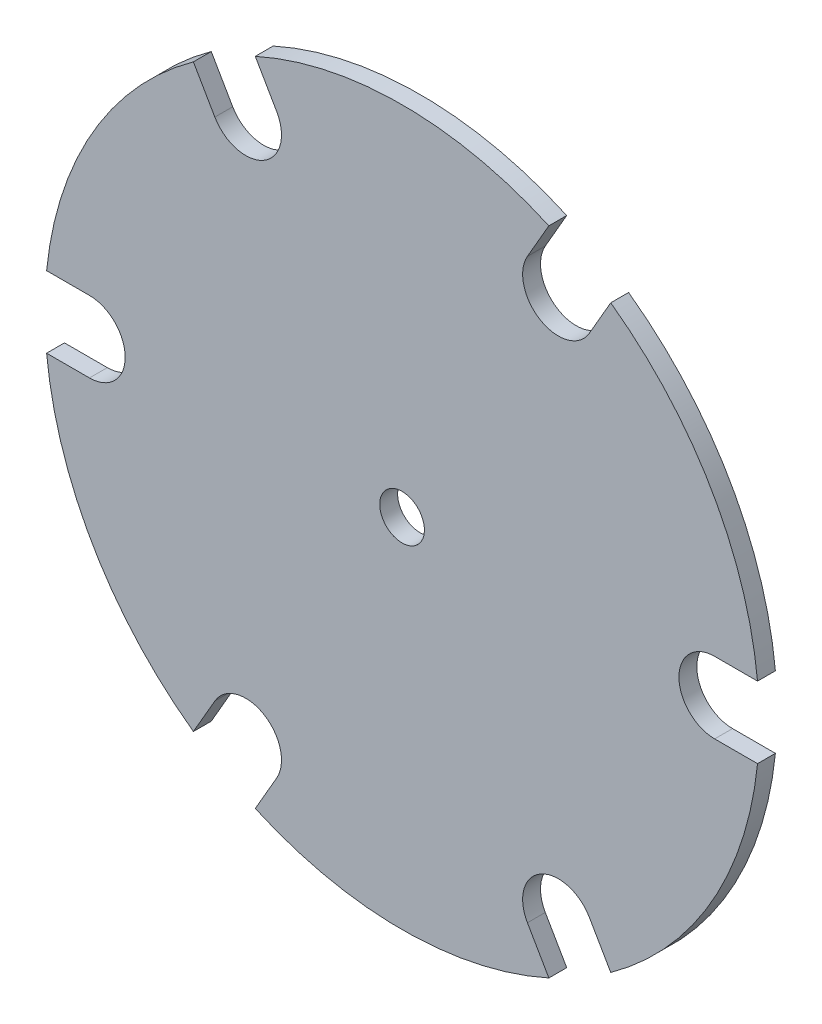
ISO-10303-21;
HEADER;
FILE_DESCRIPTION(('STEP AP214'),'2;1');
FILE_NAME('part.step','',(''),(''),'','','');
FILE_SCHEMA(('AUTOMOTIVE_DESIGN { 1 0 10303 214 1 1 1 1 }'));
ENDSEC;
DATA;
#1=APPLICATION_CONTEXT('core data for automotive mechanical design processes');
#2=APPLICATION_PROTOCOL_DEFINITION('international standard','automotive_design',2000,#1);
#3=PRODUCT_CONTEXT('',#1,'mechanical');
#4=PRODUCT('Part','Part','',(#3));
#5=PRODUCT_RELATED_PRODUCT_CATEGORY('part','',(#4));
#6=PRODUCT_DEFINITION_FORMATION('','',#4);
#7=PRODUCT_DEFINITION_CONTEXT('part definition',#1,'design');
#8=PRODUCT_DEFINITION('design','',#6,#7);
#9=PRODUCT_DEFINITION_SHAPE('','',#8);
#10=(LENGTH_UNIT() NAMED_UNIT(*) SI_UNIT(.MILLI.,.METRE.));
#11=(NAMED_UNIT(*) PLANE_ANGLE_UNIT() SI_UNIT($,.RADIAN.));
#12=(NAMED_UNIT(*) SI_UNIT($,.STERADIAN.) SOLID_ANGLE_UNIT());
#13=UNCERTAINTY_MEASURE_WITH_UNIT(LENGTH_MEASURE(1.E-05),#10,'distance_accuracy_value','');
#14=(GEOMETRIC_REPRESENTATION_CONTEXT(3) GLOBAL_UNCERTAINTY_ASSIGNED_CONTEXT((#13)) GLOBAL_UNIT_ASSIGNED_CONTEXT((#10,
#11,#12)) REPRESENTATION_CONTEXT('',''));
#15=CARTESIAN_POINT('',(0.,0.,0.));
#16=DIRECTION('',(0.,0.,1.));
#17=DIRECTION('',(1.,0.,0.));
#18=AXIS2_PLACEMENT_3D('',#15,#16,#17);
#19=CARTESIAN_POINT('',(-35.,0.,2.));
#20=DIRECTION('',(0.,0.,1.));
#21=DIRECTION('',(1.,0.,0.));
#22=AXIS2_PLACEMENT_3D('',#19,#20,#21);
#23=PLANE('',#22);
#24=CARTESIAN_POINT('',(-35.,0.,2.));
#25=DIRECTION('',(0.,0.,-1.));
#26=DIRECTION('',(1.,0.,0.));
#27=AXIS2_PLACEMENT_3D('',#24,#25,#26);
#28=CIRCLE('',#27,4.);
#29=CARTESIAN_POINT('',(-35.,4.,2.));
#30=VERTEX_POINT('',#29);
#31=CARTESIAN_POINT('',(-35.,-4.,2.));
#32=VERTEX_POINT('',#31);
#33=EDGE_CURVE('E273',#30,#32,#28,.T.);
#34=ORIENTED_EDGE('',*,*,#33,.T.);
#35=DIRECTION('',(-1.,0.,0.));
#36=VECTOR('',#35,1.);
#37=CARTESIAN_POINT('',(-35.,-4.,2.));
#38=LINE('',#37,#36);
#39=CARTESIAN_POINT('',(-39.7994974842648,-3.99999999999999,2.));
#40=VERTEX_POINT('',#39);
#41=EDGE_CURVE('E141',#32,#40,#38,.T.);
#42=ORIENTED_EDGE('',*,*,#41,.T.);
#43=CARTESIAN_POINT('',(0.,0.,2.));
#44=DIRECTION('',(0.,0.,1.));
#45=DIRECTION('',(1.,0.,0.));
#46=AXIS2_PLACEMENT_3D('',#43,#44,#45);
#47=CIRCLE('',#46,40.);
#48=CARTESIAN_POINT('',(-23.3638503572701,-32.4673758792282,2.));
#49=VERTEX_POINT('',#48);
#50=EDGE_CURVE('E336',#40,#49,#47,.T.);
#51=ORIENTED_EDGE('',*,*,#50,.T.);
#52=DIRECTION('',(0.500000000000002,0.866025403784437,0.));
#53=VECTOR('',#52,1.);
#54=CARTESIAN_POINT('',(-20.9641016151377,-28.3108891324554,2.));
#55=LINE('',#54,#53);
#56=CARTESIAN_POINT('',(-20.9641016151377,-28.3108891324554,2.));
#57=VERTEX_POINT('',#56);
#58=EDGE_CURVE('E355',#49,#57,#55,.T.);
#59=ORIENTED_EDGE('',*,*,#58,.T.);
#60=CARTESIAN_POINT('',(-17.5,-30.3108891324554,2.));
#61=DIRECTION('',(0.,0.,-1.));
#62=DIRECTION('',(1.,0.,0.));
#63=AXIS2_PLACEMENT_3D('',#60,#61,#62);
#64=CIRCLE('',#63,4.);
#65=CARTESIAN_POINT('',(-14.0358983848622,-32.3108891324554,2.));
#66=VERTEX_POINT('',#65);
#67=EDGE_CURVE('E352',#57,#66,#64,.T.);
#68=ORIENTED_EDGE('',*,*,#67,.T.);
#69=DIRECTION('',(-0.499999999999999,-0.866025403784439,0.));
#70=VECTOR('',#69,1.);
#71=CARTESIAN_POINT('',(-14.0358983848622,-32.3108891324554,2.));
#72=LINE('',#71,#70);
#73=CARTESIAN_POINT('',(-16.4356471269946,-36.4673758792282,2.));
#74=VERTEX_POINT('',#73);
#75=EDGE_CURVE('E354',#66,#74,#72,.T.);
#76=ORIENTED_EDGE('',*,*,#75,.T.);
#77=CARTESIAN_POINT('',(0.,0.,2.));
#78=DIRECTION('',(0.,0.,1.));
#79=DIRECTION('',(1.,0.,0.));
#80=AXIS2_PLACEMENT_3D('',#77,#78,#79);
#81=CIRCLE('',#80,40.);
#82=CARTESIAN_POINT('',(16.4356471269947,-36.4673758792282,2.));
#83=VERTEX_POINT('',#82);
#84=EDGE_CURVE('E357',#74,#83,#81,.T.);
#85=ORIENTED_EDGE('',*,*,#84,.T.);
#86=DIRECTION('',(-0.499999999999999,0.866025403784439,0.));
#87=VECTOR('',#86,1.);
#88=CARTESIAN_POINT('',(14.0358983848623,-32.3108891324554,2.));
#89=LINE('',#88,#87);
#90=CARTESIAN_POINT('',(14.0358983848623,-32.3108891324554,2.));
#91=VERTEX_POINT('',#90);
#92=EDGE_CURVE('E363',#83,#91,#89,.T.);
#93=ORIENTED_EDGE('',*,*,#92,.T.);
#94=CARTESIAN_POINT('',(17.5,-30.3108891324554,2.));
#95=DIRECTION('',(0.,0.,-1.));
#96=DIRECTION('',(1.,0.,0.));
#97=AXIS2_PLACEMENT_3D('',#94,#95,#96);
#98=CIRCLE('',#97,4.);
#99=CARTESIAN_POINT('',(20.9641016151378,-28.3108891324553,2.));
#100=VERTEX_POINT('',#99);
#101=EDGE_CURVE('E365',#91,#100,#98,.T.);
#102=ORIENTED_EDGE('',*,*,#101,.T.);
#103=DIRECTION('',(0.5,-0.866025403784439,0.));
#104=VECTOR('',#103,1.);
#105=CARTESIAN_POINT('',(20.9641016151378,-28.3108891324553,2.));
#106=LINE('',#105,#104);
#107=CARTESIAN_POINT('',(23.3638503572702,-32.4673758792282,2.));
#108=VERTEX_POINT('',#107);
#109=EDGE_CURVE('E367',#100,#108,#106,.T.);
#110=ORIENTED_EDGE('',*,*,#109,.T.);
#111=CARTESIAN_POINT('',(0.,0.,2.));
#112=DIRECTION('',(0.,0.,1.));
#113=DIRECTION('',(1.,0.,0.));
#114=AXIS2_PLACEMENT_3D('',#111,#112,#113);
#115=CIRCLE('',#114,40.);
#116=CARTESIAN_POINT('',(39.7994974842648,-4.,2.));
#117=VERTEX_POINT('',#116);
#118=EDGE_CURVE('E369',#108,#117,#115,.T.);
#119=ORIENTED_EDGE('',*,*,#118,.T.);
#120=DIRECTION('',(-1.,0.,0.));
#121=VECTOR('',#120,1.);
#122=CARTESIAN_POINT('',(35.,-4.,2.));
#123=LINE('',#122,#121);
#124=CARTESIAN_POINT('',(35.,-4.,2.));
#125=VERTEX_POINT('',#124);
#126=EDGE_CURVE('E371',#117,#125,#123,.T.);
#127=ORIENTED_EDGE('',*,*,#126,.T.);
#128=CARTESIAN_POINT('',(35.,0.,2.));
#129=DIRECTION('',(0.,0.,-1.));
#130=DIRECTION('',(1.,0.,0.));
#131=AXIS2_PLACEMENT_3D('',#128,#129,#130);
#132=CIRCLE('',#131,4.);
#133=CARTESIAN_POINT('',(35.,4.,2.));
#134=VERTEX_POINT('',#133);
#135=EDGE_CURVE('E373',#125,#134,#132,.T.);
#136=ORIENTED_EDGE('',*,*,#135,.T.);
#137=DIRECTION('',(1.,0.,0.));
#138=VECTOR('',#137,1.);
#139=CARTESIAN_POINT('',(35.,4.,2.));
#140=LINE('',#139,#138);
#141=CARTESIAN_POINT('',(39.7994974842648,4.00000000000001,2.));
#142=VERTEX_POINT('',#141);
#143=EDGE_CURVE('E375',#134,#142,#140,.T.);
#144=ORIENTED_EDGE('',*,*,#143,.T.);
#145=CARTESIAN_POINT('',(0.,0.,2.));
#146=DIRECTION('',(0.,0.,1.));
#147=DIRECTION('',(1.,0.,0.));
#148=AXIS2_PLACEMENT_3D('',#145,#146,#147);
#149=CIRCLE('',#148,40.);
#150=CARTESIAN_POINT('',(23.3638503572701,32.4673758792282,2.));
#151=VERTEX_POINT('',#150);
#152=EDGE_CURVE('E377',#142,#151,#149,.T.);
#153=ORIENTED_EDGE('',*,*,#152,.T.);
#154=DIRECTION('',(-0.5,-0.866025403784439,0.));
#155=VECTOR('',#154,1.);
#156=CARTESIAN_POINT('',(20.9641016151378,28.3108891324554,2.));
#157=LINE('',#156,#155);
#158=CARTESIAN_POINT('',(20.9641016151378,28.3108891324554,2.));
#159=VERTEX_POINT('',#158);
#160=EDGE_CURVE('E379',#151,#159,#157,.T.);
#161=ORIENTED_EDGE('',*,*,#160,.T.);
#162=CARTESIAN_POINT('',(17.5,30.3108891324554,2.));
#163=DIRECTION('',(0.,0.,-1.));
#164=DIRECTION('',(1.,0.,0.));
#165=AXIS2_PLACEMENT_3D('',#162,#163,#164);
#166=CIRCLE('',#165,4.);
#167=CARTESIAN_POINT('',(14.0358983848622,32.3108891324554,2.));
#168=VERTEX_POINT('',#167);
#169=EDGE_CURVE('E381',#159,#168,#166,.T.);
#170=ORIENTED_EDGE('',*,*,#169,.T.);
#171=DIRECTION('',(0.499999999999999,0.866025403784439,0.));
#172=VECTOR('',#171,1.);
#173=CARTESIAN_POINT('',(14.0358983848622,32.3108891324554,2.));
#174=LINE('',#173,#172);
#175=CARTESIAN_POINT('',(16.4356471269946,36.4673758792282,2.));
#176=VERTEX_POINT('',#175);
#177=EDGE_CURVE('E383',#168,#176,#174,.T.);
#178=ORIENTED_EDGE('',*,*,#177,.T.);
#179=CARTESIAN_POINT('',(0.,0.,2.));
#180=DIRECTION('',(0.,0.,1.));
#181=DIRECTION('',(1.,0.,0.));
#182=AXIS2_PLACEMENT_3D('',#179,#180,#181);
#183=CIRCLE('',#182,40.);
#184=CARTESIAN_POINT('',(-16.4356471269946,36.4673758792282,2.));
#185=VERTEX_POINT('',#184);
#186=EDGE_CURVE('E385',#176,#185,#183,.T.);
#187=ORIENTED_EDGE('',*,*,#186,.T.);
#188=DIRECTION('',(0.5,-0.866025403784439,0.));
#189=VECTOR('',#188,1.);
#190=CARTESIAN_POINT('',(-14.0358983848623,32.3108891324554,2.));
#191=LINE('',#190,#189);
#192=CARTESIAN_POINT('',(-14.0358983848623,32.3108891324554,2.));
#193=VERTEX_POINT('',#192);
#194=EDGE_CURVE('E387',#185,#193,#191,.T.);
#195=ORIENTED_EDGE('',*,*,#194,.T.);
#196=CARTESIAN_POINT('',(-17.5,30.3108891324554,2.));
#197=DIRECTION('',(0.,0.,-1.));
#198=DIRECTION('',(1.,0.,0.));
#199=AXIS2_PLACEMENT_3D('',#196,#197,#198);
#200=CIRCLE('',#199,4.);
#201=CARTESIAN_POINT('',(-20.9641016151378,28.3108891324554,2.));
#202=VERTEX_POINT('',#201);
#203=EDGE_CURVE('E208',#193,#202,#200,.T.);
#204=ORIENTED_EDGE('',*,*,#203,.T.);
#205=DIRECTION('',(-0.5,0.866025403784438,0.));
#206=VECTOR('',#205,1.);
#207=CARTESIAN_POINT('',(-20.9641016151378,28.3108891324554,2.));
#208=LINE('',#207,#206);
#209=CARTESIAN_POINT('',(-23.3638503572702,32.4673758792282,2.));
#210=VERTEX_POINT('',#209);
#211=EDGE_CURVE('E202',#202,#210,#208,.T.);
#212=ORIENTED_EDGE('',*,*,#211,.T.);
#213=CARTESIAN_POINT('',(0.,0.,2.));
#214=DIRECTION('',(0.,0.,1.));
#215=DIRECTION('',(1.,0.,0.));
#216=AXIS2_PLACEMENT_3D('',#213,#214,#215);
#217=CIRCLE('',#216,40.);
#218=CARTESIAN_POINT('',(-39.7994974842648,4.,2.));
#219=VERTEX_POINT('',#218);
#220=EDGE_CURVE('E206',#210,#219,#217,.T.);
#221=ORIENTED_EDGE('',*,*,#220,.T.);
#222=DIRECTION('',(1.,0.,0.));
#223=VECTOR('',#222,1.);
#224=CARTESIAN_POINT('',(-35.,4.,2.));
#225=LINE('',#224,#223);
#226=EDGE_CURVE('E50',#219,#30,#225,.T.);
#227=ORIENTED_EDGE('',*,*,#226,.T.);
#228=EDGE_LOOP('',(#34,#42,#51,#59,#68,#76,#85,#93,#102,#110,#119,#127,#136,#144,#153,#161,#170,
#178,#187,#195,#204,#212,#221,#227));
#229=FACE_BOUND('',#228,.T.);
#230=CARTESIAN_POINT('',(0.,0.,2.));
#231=DIRECTION('',(0.,0.,1.));
#232=DIRECTION('',(1.,0.,0.));
#233=AXIS2_PLACEMENT_3D('',#230,#231,#232);
#234=CIRCLE('',#233,2.5);
#235=CARTESIAN_POINT('',(2.5,0.,2.));
#236=VERTEX_POINT('',#235);
#237=EDGE_CURVE('E230',#236,#236,#234,.T.);
#238=ORIENTED_EDGE('',*,*,#237,.F.);
#239=EDGE_LOOP('',(#238));
#240=FACE_BOUND('',#239,.T.);
#241=ADVANCED_FACE('F33',(#229,#240),#23,.T.);
#242=CARTESIAN_POINT('',(-35.,0.,0.));
#243=DIRECTION('',(0.,0.,1.));
#244=DIRECTION('',(1.,0.,0.));
#245=AXIS2_PLACEMENT_3D('',#242,#243,#244);
#246=PLANE('',#245);
#247=CARTESIAN_POINT('',(-35.,0.,0.));
#248=DIRECTION('',(0.,0.,-1.));
#249=DIRECTION('',(1.,0.,0.));
#250=AXIS2_PLACEMENT_3D('',#247,#248,#249);
#251=CIRCLE('',#250,4.);
#252=CARTESIAN_POINT('',(-35.,4.,0.));
#253=VERTEX_POINT('',#252);
#254=CARTESIAN_POINT('',(-35.,-4.,0.));
#255=VERTEX_POINT('',#254);
#256=EDGE_CURVE('E226',#253,#255,#251,.T.);
#257=ORIENTED_EDGE('',*,*,#256,.F.);
#258=DIRECTION('',(1.,0.,0.));
#259=VECTOR('',#258,1.);
#260=CARTESIAN_POINT('',(-35.,4.,0.));
#261=LINE('',#260,#259);
#262=CARTESIAN_POINT('',(-39.7994974842648,4.,0.));
#263=VERTEX_POINT('',#262);
#264=EDGE_CURVE('E133',#263,#253,#261,.T.);
#265=ORIENTED_EDGE('',*,*,#264,.F.);
#266=CARTESIAN_POINT('',(0.,0.,0.));
#267=DIRECTION('',(0.,0.,1.));
#268=DIRECTION('',(1.,0.,0.));
#269=AXIS2_PLACEMENT_3D('',#266,#267,#268);
#270=CIRCLE('',#269,40.);
#271=CARTESIAN_POINT('',(-23.3638503572702,32.4673758792282,0.));
#272=VERTEX_POINT('',#271);
#273=EDGE_CURVE('E127',#272,#263,#270,.T.);
#274=ORIENTED_EDGE('',*,*,#273,.F.);
#275=DIRECTION('',(-0.5,0.866025403784438,0.));
#276=VECTOR('',#275,1.);
#277=CARTESIAN_POINT('',(-20.9641016151378,28.3108891324554,0.));
#278=LINE('',#277,#276);
#279=CARTESIAN_POINT('',(-20.9641016151378,28.3108891324554,0.));
#280=VERTEX_POINT('',#279);
#281=EDGE_CURVE('E216',#280,#272,#278,.T.);
#282=ORIENTED_EDGE('',*,*,#281,.F.);
#283=CARTESIAN_POINT('',(-17.5,30.3108891324554,0.));
#284=DIRECTION('',(0.,0.,-1.));
#285=DIRECTION('',(1.,0.,0.));
#286=AXIS2_PLACEMENT_3D('',#283,#284,#285);
#287=CIRCLE('',#286,4.);
#288=CARTESIAN_POINT('',(-14.0358983848623,32.3108891324554,0.));
#289=VERTEX_POINT('',#288);
#290=EDGE_CURVE('E268',#289,#280,#287,.T.);
#291=ORIENTED_EDGE('',*,*,#290,.F.);
#292=DIRECTION('',(0.5,-0.866025403784439,0.));
#293=VECTOR('',#292,1.);
#294=CARTESIAN_POINT('',(-14.0358983848623,32.3108891324554,0.));
#295=LINE('',#294,#293);
#296=CARTESIAN_POINT('',(-16.4356471269946,36.4673758792282,0.));
#297=VERTEX_POINT('',#296);
#298=EDGE_CURVE('E266',#297,#289,#295,.T.);
#299=ORIENTED_EDGE('',*,*,#298,.F.);
#300=CARTESIAN_POINT('',(0.,0.,0.));
#301=DIRECTION('',(0.,0.,1.));
#302=DIRECTION('',(1.,0.,0.));
#303=AXIS2_PLACEMENT_3D('',#300,#301,#302);
#304=CIRCLE('',#303,40.);
#305=CARTESIAN_POINT('',(16.4356471269946,36.4673758792282,0.));
#306=VERTEX_POINT('',#305);
#307=EDGE_CURVE('E264',#306,#297,#304,.T.);
#308=ORIENTED_EDGE('',*,*,#307,.F.);
#309=DIRECTION('',(0.499999999999999,0.866025403784439,0.));
#310=VECTOR('',#309,1.);
#311=CARTESIAN_POINT('',(14.0358983848622,32.3108891324554,0.));
#312=LINE('',#311,#310);
#313=CARTESIAN_POINT('',(14.0358983848622,32.3108891324554,0.));
#314=VERTEX_POINT('',#313);
#315=EDGE_CURVE('E262',#314,#306,#312,.T.);
#316=ORIENTED_EDGE('',*,*,#315,.F.);
#317=CARTESIAN_POINT('',(17.5,30.3108891324554,0.));
#318=DIRECTION('',(0.,0.,-1.));
#319=DIRECTION('',(1.,0.,0.));
#320=AXIS2_PLACEMENT_3D('',#317,#318,#319);
#321=CIRCLE('',#320,4.);
#322=CARTESIAN_POINT('',(20.9641016151378,28.3108891324554,0.));
#323=VERTEX_POINT('',#322);
#324=EDGE_CURVE('E260',#323,#314,#321,.T.);
#325=ORIENTED_EDGE('',*,*,#324,.F.);
#326=DIRECTION('',(-0.5,-0.866025403784439,0.));
#327=VECTOR('',#326,1.);
#328=CARTESIAN_POINT('',(20.9641016151378,28.3108891324554,0.));
#329=LINE('',#328,#327);
#330=CARTESIAN_POINT('',(23.3638503572701,32.4673758792282,0.));
#331=VERTEX_POINT('',#330);
#332=EDGE_CURVE('E258',#331,#323,#329,.T.);
#333=ORIENTED_EDGE('',*,*,#332,.F.);
#334=CARTESIAN_POINT('',(0.,0.,0.));
#335=DIRECTION('',(0.,0.,1.));
#336=DIRECTION('',(1.,0.,0.));
#337=AXIS2_PLACEMENT_3D('',#334,#335,#336);
#338=CIRCLE('',#337,40.);
#339=CARTESIAN_POINT('',(39.7994974842648,4.00000000000001,0.));
#340=VERTEX_POINT('',#339);
#341=EDGE_CURVE('E256',#340,#331,#338,.T.);
#342=ORIENTED_EDGE('',*,*,#341,.F.);
#343=DIRECTION('',(1.,0.,0.));
#344=VECTOR('',#343,1.);
#345=CARTESIAN_POINT('',(35.,4.,0.));
#346=LINE('',#345,#344);
#347=CARTESIAN_POINT('',(35.,4.,0.));
#348=VERTEX_POINT('',#347);
#349=EDGE_CURVE('E254',#348,#340,#346,.T.);
#350=ORIENTED_EDGE('',*,*,#349,.F.);
#351=CARTESIAN_POINT('',(35.,0.,0.));
#352=DIRECTION('',(0.,0.,-1.));
#353=DIRECTION('',(1.,0.,0.));
#354=AXIS2_PLACEMENT_3D('',#351,#352,#353);
#355=CIRCLE('',#354,4.);
#356=CARTESIAN_POINT('',(35.,-4.,0.));
#357=VERTEX_POINT('',#356);
#358=EDGE_CURVE('E252',#357,#348,#355,.T.);
#359=ORIENTED_EDGE('',*,*,#358,.F.);
#360=DIRECTION('',(-1.,0.,0.));
#361=VECTOR('',#360,1.);
#362=CARTESIAN_POINT('',(35.,-4.,0.));
#363=LINE('',#362,#361);
#364=CARTESIAN_POINT('',(39.7994974842648,-4.,0.));
#365=VERTEX_POINT('',#364);
#366=EDGE_CURVE('E250',#365,#357,#363,.T.);
#367=ORIENTED_EDGE('',*,*,#366,.F.);
#368=CARTESIAN_POINT('',(0.,0.,0.));
#369=DIRECTION('',(0.,0.,1.));
#370=DIRECTION('',(1.,0.,0.));
#371=AXIS2_PLACEMENT_3D('',#368,#369,#370);
#372=CIRCLE('',#371,40.);
#373=CARTESIAN_POINT('',(23.3638503572702,-32.4673758792282,0.));
#374=VERTEX_POINT('',#373);
#375=EDGE_CURVE('E248',#374,#365,#372,.T.);
#376=ORIENTED_EDGE('',*,*,#375,.F.);
#377=DIRECTION('',(0.5,-0.866025403784439,0.));
#378=VECTOR('',#377,1.);
#379=CARTESIAN_POINT('',(20.9641016151378,-28.3108891324553,0.));
#380=LINE('',#379,#378);
#381=CARTESIAN_POINT('',(20.9641016151378,-28.3108891324553,0.));
#382=VERTEX_POINT('',#381);
#383=EDGE_CURVE('E246',#382,#374,#380,.T.);
#384=ORIENTED_EDGE('',*,*,#383,.F.);
#385=CARTESIAN_POINT('',(17.5,-30.3108891324554,0.));
#386=DIRECTION('',(0.,0.,-1.));
#387=DIRECTION('',(1.,0.,0.));
#388=AXIS2_PLACEMENT_3D('',#385,#386,#387);
#389=CIRCLE('',#388,4.);
#390=CARTESIAN_POINT('',(14.0358983848623,-32.3108891324554,0.));
#391=VERTEX_POINT('',#390);
#392=EDGE_CURVE('E244',#391,#382,#389,.T.);
#393=ORIENTED_EDGE('',*,*,#392,.F.);
#394=DIRECTION('',(-0.499999999999999,0.866025403784439,0.));
#395=VECTOR('',#394,1.);
#396=CARTESIAN_POINT('',(14.0358983848623,-32.3108891324554,0.));
#397=LINE('',#396,#395);
#398=CARTESIAN_POINT('',(16.4356471269947,-36.4673758792282,0.));
#399=VERTEX_POINT('',#398);
#400=EDGE_CURVE('E242',#399,#391,#397,.T.);
#401=ORIENTED_EDGE('',*,*,#400,.F.);
#402=CARTESIAN_POINT('',(0.,0.,0.));
#403=DIRECTION('',(0.,0.,1.));
#404=DIRECTION('',(1.,0.,0.));
#405=AXIS2_PLACEMENT_3D('',#402,#403,#404);
#406=CIRCLE('',#405,40.);
#407=CARTESIAN_POINT('',(-16.4356471269946,-36.4673758792282,0.));
#408=VERTEX_POINT('',#407);
#409=EDGE_CURVE('E240',#408,#399,#406,.T.);
#410=ORIENTED_EDGE('',*,*,#409,.F.);
#411=DIRECTION('',(-0.499999999999999,-0.866025403784439,0.));
#412=VECTOR('',#411,1.);
#413=CARTESIAN_POINT('',(-14.0358983848622,-32.3108891324554,0.));
#414=LINE('',#413,#412);
#415=CARTESIAN_POINT('',(-14.0358983848622,-32.3108891324554,0.));
#416=VERTEX_POINT('',#415);
#417=EDGE_CURVE('E238',#416,#408,#414,.T.);
#418=ORIENTED_EDGE('',*,*,#417,.F.);
#419=CARTESIAN_POINT('',(-17.5,-30.3108891324554,0.));
#420=DIRECTION('',(0.,0.,-1.));
#421=DIRECTION('',(1.,0.,0.));
#422=AXIS2_PLACEMENT_3D('',#419,#420,#421);
#423=CIRCLE('',#422,4.);
#424=CARTESIAN_POINT('',(-20.9641016151377,-28.3108891324554,0.));
#425=VERTEX_POINT('',#424);
#426=EDGE_CURVE('E236',#425,#416,#423,.T.);
#427=ORIENTED_EDGE('',*,*,#426,.F.);
#428=DIRECTION('',(0.500000000000002,0.866025403784437,0.));
#429=VECTOR('',#428,1.);
#430=CARTESIAN_POINT('',(-20.9641016151377,-28.3108891324554,0.));
#431=LINE('',#430,#429);
#432=CARTESIAN_POINT('',(-23.3638503572701,-32.4673758792282,0.));
#433=VERTEX_POINT('',#432);
#434=EDGE_CURVE('E234',#433,#425,#431,.T.);
#435=ORIENTED_EDGE('',*,*,#434,.F.);
#436=CARTESIAN_POINT('',(0.,0.,0.));
#437=DIRECTION('',(0.,0.,1.));
#438=DIRECTION('',(1.,0.,0.));
#439=AXIS2_PLACEMENT_3D('',#436,#437,#438);
#440=CIRCLE('',#439,40.);
#441=CARTESIAN_POINT('',(-39.7994974842648,-3.99999999999999,0.));
#442=VERTEX_POINT('',#441);
#443=EDGE_CURVE('E232',#442,#433,#440,.T.);
#444=ORIENTED_EDGE('',*,*,#443,.F.);
#445=DIRECTION('',(-1.,0.,0.));
#446=VECTOR('',#445,1.);
#447=CARTESIAN_POINT('',(-35.,-4.,0.));
#448=LINE('',#447,#446);
#449=EDGE_CURVE('E229',#255,#442,#448,.T.);
#450=ORIENTED_EDGE('',*,*,#449,.F.);
#451=EDGE_LOOP('',(#257,#265,#274,#282,#291,#299,#308,#316,#325,#333,#342,#350,#359,#367,#376,
#384,#393,#401,#410,#418,#427,#435,#444,#450));
#452=FACE_BOUND('',#451,.T.);
#453=CARTESIAN_POINT('',(0.,0.,0.));
#454=DIRECTION('',(0.,0.,1.));
#455=DIRECTION('',(1.,0.,0.));
#456=AXIS2_PLACEMENT_3D('',#453,#454,#455);
#457=CIRCLE('',#456,2.5);
#458=CARTESIAN_POINT('',(2.5,0.,0.));
#459=VERTEX_POINT('',#458);
#460=EDGE_CURVE('E690',#459,#459,#457,.T.);
#461=ORIENTED_EDGE('',*,*,#460,.T.);
#462=EDGE_LOOP('',(#461));
#463=FACE_BOUND('',#462,.T.);
#464=ADVANCED_FACE('F340',(#452,#463),#246,.F.);
#465=CARTESIAN_POINT('',(-35.,0.,2.));
#466=DIRECTION('',(0.,0.,-1.));
#467=DIRECTION('',(-1.,0.,0.));
#468=AXIS2_PLACEMENT_3D('',#465,#466,#467);
#469=CYLINDRICAL_SURFACE('',#468,4.);
#470=ORIENTED_EDGE('',*,*,#256,.T.);
#471=DIRECTION('',(0.,0.,-1.));
#472=VECTOR('',#471,1.);
#473=CARTESIAN_POINT('',(-35.,-4.,2.));
#474=LINE('',#473,#472);
#475=EDGE_CURVE('E11',#32,#255,#474,.T.);
#476=ORIENTED_EDGE('',*,*,#475,.F.);
#477=ORIENTED_EDGE('',*,*,#33,.F.);
#478=DIRECTION('',(0.,0.,-1.));
#479=VECTOR('',#478,1.);
#480=CARTESIAN_POINT('',(-35.,4.,2.));
#481=LINE('',#480,#479);
#482=EDGE_CURVE('E222',#30,#253,#481,.T.);
#483=ORIENTED_EDGE('',*,*,#482,.T.);
#484=EDGE_LOOP('',(#470,#476,#477,#483));
#485=FACE_BOUND('',#484,.T.);
#486=ADVANCED_FACE('F35',(#485),#469,.F.);
#487=CARTESIAN_POINT('',(-35.,-4.,2.));
#488=DIRECTION('',(0.,-1.,0.));
#489=DIRECTION('',(0.,0.,-1.));
#490=AXIS2_PLACEMENT_3D('',#487,#488,#489);
#491=PLANE('',#490);
#492=ORIENTED_EDGE('',*,*,#449,.T.);
#493=DIRECTION('',(0.,0.,-1.));
#494=VECTOR('',#493,1.);
#495=CARTESIAN_POINT('',(-39.7994974842648,-3.99999999999999,2.));
#496=LINE('',#495,#494);
#497=EDGE_CURVE('E42',#40,#442,#496,.T.);
#498=ORIENTED_EDGE('',*,*,#497,.F.);
#499=ORIENTED_EDGE('',*,*,#41,.F.);
#500=ORIENTED_EDGE('',*,*,#475,.T.);
#501=EDGE_LOOP('',(#492,#498,#499,#500));
#502=FACE_BOUND('',#501,.T.);
#503=ADVANCED_FACE('F421',(#502),#491,.F.);
#504=CARTESIAN_POINT('',(0.,0.,2.));
#505=DIRECTION('',(0.,0.,-1.));
#506=DIRECTION('',(-1.,0.,0.));
#507=AXIS2_PLACEMENT_3D('',#504,#505,#506);
#508=CYLINDRICAL_SURFACE('',#507,40.);
#509=ORIENTED_EDGE('',*,*,#443,.T.);
#510=DIRECTION('',(0.,0.,-1.));
#511=VECTOR('',#510,1.);
#512=CARTESIAN_POINT('',(-23.3638503572701,-32.4673758792282,2.));
#513=LINE('',#512,#511);
#514=EDGE_CURVE('E328',#49,#433,#513,.T.);
#515=ORIENTED_EDGE('',*,*,#514,.F.);
#516=ORIENTED_EDGE('',*,*,#50,.F.);
#517=ORIENTED_EDGE('',*,*,#497,.T.);
#518=EDGE_LOOP('',(#509,#515,#516,#517));
#519=FACE_BOUND('',#518,.T.);
#520=ADVANCED_FACE('F334',(#519),#508,.T.);
#521=CARTESIAN_POINT('',(-20.9641016151377,-28.3108891324554,2.));
#522=DIRECTION('',(-0.866025403784437,0.500000000000002,0.));
#523=DIRECTION('',(-0.500000000000002,-0.866025403784437,0.));
#524=AXIS2_PLACEMENT_3D('',#521,#522,#523);
#525=PLANE('',#524);
#526=ORIENTED_EDGE('',*,*,#434,.T.);
#527=DIRECTION('',(0.,0.,-1.));
#528=VECTOR('',#527,1.);
#529=CARTESIAN_POINT('',(-20.9641016151377,-28.3108891324554,2.));
#530=LINE('',#529,#528);
#531=EDGE_CURVE('E325',#57,#425,#530,.T.);
#532=ORIENTED_EDGE('',*,*,#531,.F.);
#533=ORIENTED_EDGE('',*,*,#58,.F.);
#534=ORIENTED_EDGE('',*,*,#514,.T.);
#535=EDGE_LOOP('',(#526,#532,#533,#534));
#536=FACE_BOUND('',#535,.T.);
#537=ADVANCED_FACE('F346',(#536),#525,.F.);
#538=CARTESIAN_POINT('',(-17.5,-30.3108891324554,2.));
#539=DIRECTION('',(0.,0.,-1.));
#540=DIRECTION('',(-1.,0.,0.));
#541=AXIS2_PLACEMENT_3D('',#538,#539,#540);
#542=CYLINDRICAL_SURFACE('',#541,4.);
#543=ORIENTED_EDGE('',*,*,#426,.T.);
#544=DIRECTION('',(0.,0.,-1.));
#545=VECTOR('',#544,1.);
#546=CARTESIAN_POINT('',(-14.0358983848622,-32.3108891324554,2.));
#547=LINE('',#546,#545);
#548=EDGE_CURVE('E322',#66,#416,#547,.T.);
#549=ORIENTED_EDGE('',*,*,#548,.F.);
#550=ORIENTED_EDGE('',*,*,#67,.F.);
#551=ORIENTED_EDGE('',*,*,#531,.T.);
#552=EDGE_LOOP('',(#543,#549,#550,#551));
#553=FACE_BOUND('',#552,.T.);
#554=ADVANCED_FACE('F350',(#553),#542,.F.);
#555=CARTESIAN_POINT('',(-14.0358983848622,-32.3108891324554,2.));
#556=DIRECTION('',(0.866025403784439,-0.499999999999999,0.));
#557=DIRECTION('',(0.499999999999999,0.866025403784439,0.));
#558=AXIS2_PLACEMENT_3D('',#555,#556,#557);
#559=PLANE('',#558);
#560=ORIENTED_EDGE('',*,*,#417,.T.);
#561=DIRECTION('',(0.,0.,-1.));
#562=VECTOR('',#561,1.);
#563=CARTESIAN_POINT('',(-16.4356471269946,-36.4673758792282,2.));
#564=LINE('',#563,#562);
#565=EDGE_CURVE('E319',#74,#408,#564,.T.);
#566=ORIENTED_EDGE('',*,*,#565,.F.);
#567=ORIENTED_EDGE('',*,*,#75,.F.);
#568=ORIENTED_EDGE('',*,*,#548,.T.);
#569=EDGE_LOOP('',(#560,#566,#567,#568));
#570=FACE_BOUND('',#569,.T.);
#571=ADVANCED_FACE('F434',(#570),#559,.F.);
#572=CARTESIAN_POINT('',(0.,0.,2.));
#573=DIRECTION('',(0.,0.,-1.));
#574=DIRECTION('',(-1.,0.,0.));
#575=AXIS2_PLACEMENT_3D('',#572,#573,#574);
#576=CYLINDRICAL_SURFACE('',#575,40.);
#577=ORIENTED_EDGE('',*,*,#409,.T.);
#578=DIRECTION('',(0.,0.,-1.));
#579=VECTOR('',#578,1.);
#580=CARTESIAN_POINT('',(16.4356471269947,-36.4673758792282,2.));
#581=LINE('',#580,#579);
#582=EDGE_CURVE('E316',#83,#399,#581,.T.);
#583=ORIENTED_EDGE('',*,*,#582,.F.);
#584=ORIENTED_EDGE('',*,*,#84,.F.);
#585=ORIENTED_EDGE('',*,*,#565,.T.);
#586=EDGE_LOOP('',(#577,#583,#584,#585));
#587=FACE_BOUND('',#586,.T.);
#588=ADVANCED_FACE('F437',(#587),#576,.T.);
#589=CARTESIAN_POINT('',(14.0358983848623,-32.3108891324554,2.));
#590=DIRECTION('',(-0.866025403784439,-0.499999999999999,0.));
#591=DIRECTION('',(0.499999999999999,-0.866025403784439,0.));
#592=AXIS2_PLACEMENT_3D('',#589,#590,#591);
#593=PLANE('',#592);
#594=ORIENTED_EDGE('',*,*,#400,.T.);
#595=DIRECTION('',(0.,0.,-1.));
#596=VECTOR('',#595,1.);
#597=CARTESIAN_POINT('',(14.0358983848623,-32.3108891324554,2.));
#598=LINE('',#597,#596);
#599=EDGE_CURVE('E313',#91,#391,#598,.T.);
#600=ORIENTED_EDGE('',*,*,#599,.F.);
#601=ORIENTED_EDGE('',*,*,#92,.F.);
#602=ORIENTED_EDGE('',*,*,#582,.T.);
#603=EDGE_LOOP('',(#594,#600,#601,#602));
#604=FACE_BOUND('',#603,.T.);
#605=ADVANCED_FACE('F441',(#604),#593,.F.);
#606=CARTESIAN_POINT('',(17.5,-30.3108891324554,2.));
#607=DIRECTION('',(0.,0.,-1.));
#608=DIRECTION('',(-1.,0.,0.));
#609=AXIS2_PLACEMENT_3D('',#606,#607,#608);
#610=CYLINDRICAL_SURFACE('',#609,4.);
#611=ORIENTED_EDGE('',*,*,#392,.T.);
#612=DIRECTION('',(0.,0.,-1.));
#613=VECTOR('',#612,1.);
#614=CARTESIAN_POINT('',(20.9641016151378,-28.3108891324553,2.));
#615=LINE('',#614,#613);
#616=EDGE_CURVE('E310',#100,#382,#615,.T.);
#617=ORIENTED_EDGE('',*,*,#616,.F.);
#618=ORIENTED_EDGE('',*,*,#101,.F.);
#619=ORIENTED_EDGE('',*,*,#599,.T.);
#620=EDGE_LOOP('',(#611,#617,#618,#619));
#621=FACE_BOUND('',#620,.T.);
#622=ADVANCED_FACE('F445',(#621),#610,.F.);
#623=CARTESIAN_POINT('',(20.9641016151378,-28.3108891324553,2.));
#624=DIRECTION('',(0.866025403784439,0.5,0.));
#625=DIRECTION('',(-0.5,0.866025403784439,0.));
#626=AXIS2_PLACEMENT_3D('',#623,#624,#625);
#627=PLANE('',#626);
#628=ORIENTED_EDGE('',*,*,#383,.T.);
#629=DIRECTION('',(0.,0.,-1.));
#630=VECTOR('',#629,1.);
#631=CARTESIAN_POINT('',(23.3638503572702,-32.4673758792282,2.));
#632=LINE('',#631,#630);
#633=EDGE_CURVE('E307',#108,#374,#632,.T.);
#634=ORIENTED_EDGE('',*,*,#633,.F.);
#635=ORIENTED_EDGE('',*,*,#109,.F.);
#636=ORIENTED_EDGE('',*,*,#616,.T.);
#637=EDGE_LOOP('',(#628,#634,#635,#636));
#638=FACE_BOUND('',#637,.T.);
#639=ADVANCED_FACE('F449',(#638),#627,.F.);
#640=CARTESIAN_POINT('',(0.,0.,2.));
#641=DIRECTION('',(0.,0.,-1.));
#642=DIRECTION('',(-1.,0.,0.));
#643=AXIS2_PLACEMENT_3D('',#640,#641,#642);
#644=CYLINDRICAL_SURFACE('',#643,40.);
#645=ORIENTED_EDGE('',*,*,#375,.T.);
#646=DIRECTION('',(0.,0.,-1.));
#647=VECTOR('',#646,1.);
#648=CARTESIAN_POINT('',(39.7994974842648,-4.,2.));
#649=LINE('',#648,#647);
#650=EDGE_CURVE('E304',#117,#365,#649,.T.);
#651=ORIENTED_EDGE('',*,*,#650,.F.);
#652=ORIENTED_EDGE('',*,*,#118,.F.);
#653=ORIENTED_EDGE('',*,*,#633,.T.);
#654=EDGE_LOOP('',(#645,#651,#652,#653));
#655=FACE_BOUND('',#654,.T.);
#656=ADVANCED_FACE('F453',(#655),#644,.T.);
#657=CARTESIAN_POINT('',(35.,-4.,2.));
#658=DIRECTION('',(0.,-1.,0.));
#659=DIRECTION('',(0.,0.,-1.));
#660=AXIS2_PLACEMENT_3D('',#657,#658,#659);
#661=PLANE('',#660);
#662=ORIENTED_EDGE('',*,*,#366,.T.);
#663=DIRECTION('',(0.,0.,-1.));
#664=VECTOR('',#663,1.);
#665=CARTESIAN_POINT('',(35.,-4.,2.));
#666=LINE('',#665,#664);
#667=EDGE_CURVE('E301',#125,#357,#666,.T.);
#668=ORIENTED_EDGE('',*,*,#667,.F.);
#669=ORIENTED_EDGE('',*,*,#126,.F.);
#670=ORIENTED_EDGE('',*,*,#650,.T.);
#671=EDGE_LOOP('',(#662,#668,#669,#670));
#672=FACE_BOUND('',#671,.T.);
#673=ADVANCED_FACE('F457',(#672),#661,.F.);
#674=CARTESIAN_POINT('',(35.,0.,2.));
#675=DIRECTION('',(0.,0.,-1.));
#676=DIRECTION('',(-1.,0.,0.));
#677=AXIS2_PLACEMENT_3D('',#674,#675,#676);
#678=CYLINDRICAL_SURFACE('',#677,4.);
#679=ORIENTED_EDGE('',*,*,#358,.T.);
#680=DIRECTION('',(0.,0.,-1.));
#681=VECTOR('',#680,1.);
#682=CARTESIAN_POINT('',(35.,4.,2.));
#683=LINE('',#682,#681);
#684=EDGE_CURVE('E298',#134,#348,#683,.T.);
#685=ORIENTED_EDGE('',*,*,#684,.F.);
#686=ORIENTED_EDGE('',*,*,#135,.F.);
#687=ORIENTED_EDGE('',*,*,#667,.T.);
#688=EDGE_LOOP('',(#679,#685,#686,#687));
#689=FACE_BOUND('',#688,.T.);
#690=ADVANCED_FACE('F461',(#689),#678,.F.);
#691=CARTESIAN_POINT('',(35.,4.,2.));
#692=DIRECTION('',(0.,1.,0.));
#693=DIRECTION('',(-1.,0.,0.));
#694=AXIS2_PLACEMENT_3D('',#691,#692,#693);
#695=PLANE('',#694);
#696=ORIENTED_EDGE('',*,*,#349,.T.);
#697=DIRECTION('',(0.,0.,-1.));
#698=VECTOR('',#697,1.);
#699=CARTESIAN_POINT('',(39.7994974842648,4.00000000000001,2.));
#700=LINE('',#699,#698);
#701=EDGE_CURVE('E295',#142,#340,#700,.T.);
#702=ORIENTED_EDGE('',*,*,#701,.F.);
#703=ORIENTED_EDGE('',*,*,#143,.F.);
#704=ORIENTED_EDGE('',*,*,#684,.T.);
#705=EDGE_LOOP('',(#696,#702,#703,#704));
#706=FACE_BOUND('',#705,.T.);
#707=ADVANCED_FACE('F465',(#706),#695,.F.);
#708=CARTESIAN_POINT('',(0.,0.,2.));
#709=DIRECTION('',(0.,0.,-1.));
#710=DIRECTION('',(-1.,0.,0.));
#711=AXIS2_PLACEMENT_3D('',#708,#709,#710);
#712=CYLINDRICAL_SURFACE('',#711,40.);
#713=ORIENTED_EDGE('',*,*,#341,.T.);
#714=DIRECTION('',(0.,0.,-1.));
#715=VECTOR('',#714,1.);
#716=CARTESIAN_POINT('',(23.3638503572701,32.4673758792282,2.));
#717=LINE('',#716,#715);
#718=EDGE_CURVE('E292',#151,#331,#717,.T.);
#719=ORIENTED_EDGE('',*,*,#718,.F.);
#720=ORIENTED_EDGE('',*,*,#152,.F.);
#721=ORIENTED_EDGE('',*,*,#701,.T.);
#722=EDGE_LOOP('',(#713,#719,#720,#721));
#723=FACE_BOUND('',#722,.T.);
#724=ADVANCED_FACE('F469',(#723),#712,.T.);
#725=CARTESIAN_POINT('',(20.9641016151378,28.3108891324554,2.));
#726=DIRECTION('',(0.866025403784439,-0.499999999999999,0.));
#727=DIRECTION('',(0.5,0.866025403784439,0.));
#728=AXIS2_PLACEMENT_3D('',#725,#726,#727);
#729=PLANE('',#728);
#730=ORIENTED_EDGE('',*,*,#332,.T.);
#731=DIRECTION('',(0.,0.,-1.));
#732=VECTOR('',#731,1.);
#733=CARTESIAN_POINT('',(20.9641016151378,28.3108891324554,2.));
#734=LINE('',#733,#732);
#735=EDGE_CURVE('E289',#159,#323,#734,.T.);
#736=ORIENTED_EDGE('',*,*,#735,.F.);
#737=ORIENTED_EDGE('',*,*,#160,.F.);
#738=ORIENTED_EDGE('',*,*,#718,.T.);
#739=EDGE_LOOP('',(#730,#736,#737,#738));
#740=FACE_BOUND('',#739,.T.);
#741=ADVANCED_FACE('F473',(#740),#729,.F.);
#742=CARTESIAN_POINT('',(17.5,30.3108891324554,2.));
#743=DIRECTION('',(0.,0.,-1.));
#744=DIRECTION('',(-1.,0.,0.));
#745=AXIS2_PLACEMENT_3D('',#742,#743,#744);
#746=CYLINDRICAL_SURFACE('',#745,4.);
#747=ORIENTED_EDGE('',*,*,#324,.T.);
#748=DIRECTION('',(0.,0.,-1.));
#749=VECTOR('',#748,1.);
#750=CARTESIAN_POINT('',(14.0358983848622,32.3108891324554,2.));
#751=LINE('',#750,#749);
#752=EDGE_CURVE('E286',#168,#314,#751,.T.);
#753=ORIENTED_EDGE('',*,*,#752,.F.);
#754=ORIENTED_EDGE('',*,*,#169,.F.);
#755=ORIENTED_EDGE('',*,*,#735,.T.);
#756=EDGE_LOOP('',(#747,#753,#754,#755));
#757=FACE_BOUND('',#756,.T.);
#758=ADVANCED_FACE('F477',(#757),#746,.F.);
#759=CARTESIAN_POINT('',(14.0358983848622,32.3108891324554,2.));
#760=DIRECTION('',(-0.866025403784439,0.499999999999999,0.));
#761=DIRECTION('',(-0.499999999999999,-0.866025403784439,0.));
#762=AXIS2_PLACEMENT_3D('',#759,#760,#761);
#763=PLANE('',#762);
#764=ORIENTED_EDGE('',*,*,#315,.T.);
#765=DIRECTION('',(0.,0.,-1.));
#766=VECTOR('',#765,1.);
#767=CARTESIAN_POINT('',(16.4356471269946,36.4673758792282,2.));
#768=LINE('',#767,#766);
#769=EDGE_CURVE('E283',#176,#306,#768,.T.);
#770=ORIENTED_EDGE('',*,*,#769,.F.);
#771=ORIENTED_EDGE('',*,*,#177,.F.);
#772=ORIENTED_EDGE('',*,*,#752,.T.);
#773=EDGE_LOOP('',(#764,#770,#771,#772));
#774=FACE_BOUND('',#773,.T.);
#775=ADVANCED_FACE('F481',(#774),#763,.F.);
#776=CARTESIAN_POINT('',(0.,0.,2.));
#777=DIRECTION('',(0.,0.,-1.));
#778=DIRECTION('',(-1.,0.,0.));
#779=AXIS2_PLACEMENT_3D('',#776,#777,#778);
#780=CYLINDRICAL_SURFACE('',#779,40.);
#781=ORIENTED_EDGE('',*,*,#307,.T.);
#782=DIRECTION('',(0.,0.,-1.));
#783=VECTOR('',#782,1.);
#784=CARTESIAN_POINT('',(-16.4356471269946,36.4673758792282,2.));
#785=LINE('',#784,#783);
#786=EDGE_CURVE('E280',#185,#297,#785,.T.);
#787=ORIENTED_EDGE('',*,*,#786,.F.);
#788=ORIENTED_EDGE('',*,*,#186,.F.);
#789=ORIENTED_EDGE('',*,*,#769,.T.);
#790=EDGE_LOOP('',(#781,#787,#788,#789));
#791=FACE_BOUND('',#790,.T.);
#792=ADVANCED_FACE('F485',(#791),#780,.T.);
#793=CARTESIAN_POINT('',(-14.0358983848623,32.3108891324554,2.));
#794=DIRECTION('',(0.866025403784439,0.5,0.));
#795=DIRECTION('',(-0.5,0.866025403784439,0.));
#796=AXIS2_PLACEMENT_3D('',#793,#794,#795);
#797=PLANE('',#796);
#798=ORIENTED_EDGE('',*,*,#298,.T.);
#799=DIRECTION('',(0.,0.,-1.));
#800=VECTOR('',#799,1.);
#801=CARTESIAN_POINT('',(-14.0358983848623,32.3108891324554,2.));
#802=LINE('',#801,#800);
#803=EDGE_CURVE('E277',#193,#289,#802,.T.);
#804=ORIENTED_EDGE('',*,*,#803,.F.);
#805=ORIENTED_EDGE('',*,*,#194,.F.);
#806=ORIENTED_EDGE('',*,*,#786,.T.);
#807=EDGE_LOOP('',(#798,#804,#805,#806));
#808=FACE_BOUND('',#807,.T.);
#809=ADVANCED_FACE('F393',(#808),#797,.F.);
#810=CARTESIAN_POINT('',(-17.5,30.3108891324554,2.));
#811=DIRECTION('',(0.,0.,-1.));
#812=DIRECTION('',(-1.,0.,0.));
#813=AXIS2_PLACEMENT_3D('',#810,#811,#812);
#814=CYLINDRICAL_SURFACE('',#813,4.);
#815=ORIENTED_EDGE('',*,*,#290,.T.);
#816=DIRECTION('',(0.,0.,-1.));
#817=VECTOR('',#816,1.);
#818=CARTESIAN_POINT('',(-20.9641016151378,28.3108891324554,2.));
#819=LINE('',#818,#817);
#820=EDGE_CURVE('E217',#202,#280,#819,.T.);
#821=ORIENTED_EDGE('',*,*,#820,.F.);
#822=ORIENTED_EDGE('',*,*,#203,.F.);
#823=ORIENTED_EDGE('',*,*,#803,.T.);
#824=EDGE_LOOP('',(#815,#821,#822,#823));
#825=FACE_BOUND('',#824,.T.);
#826=ADVANCED_FACE('F397',(#825),#814,.F.);
#827=CARTESIAN_POINT('',(-20.9641016151378,28.3108891324554,2.));
#828=DIRECTION('',(-0.866025403784439,-0.5,0.));
#829=DIRECTION('',(0.5,-0.866025403784438,0.));
#830=AXIS2_PLACEMENT_3D('',#827,#828,#829);
#831=PLANE('',#830);
#832=ORIENTED_EDGE('',*,*,#281,.T.);
#833=DIRECTION('',(0.,0.,-1.));
#834=VECTOR('',#833,1.);
#835=CARTESIAN_POINT('',(-23.3638503572702,32.4673758792282,2.));
#836=LINE('',#835,#834);
#837=EDGE_CURVE('E213',#210,#272,#836,.T.);
#838=ORIENTED_EDGE('',*,*,#837,.F.);
#839=ORIENTED_EDGE('',*,*,#211,.F.);
#840=ORIENTED_EDGE('',*,*,#820,.T.);
#841=EDGE_LOOP('',(#832,#838,#839,#840));
#842=FACE_BOUND('',#841,.T.);
#843=ADVANCED_FACE('F214',(#842),#831,.F.);
#844=CARTESIAN_POINT('',(0.,0.,2.));
#845=DIRECTION('',(0.,0.,-1.));
#846=DIRECTION('',(-1.,0.,0.));
#847=AXIS2_PLACEMENT_3D('',#844,#845,#846);
#848=CYLINDRICAL_SURFACE('',#847,40.);
#849=ORIENTED_EDGE('',*,*,#273,.T.);
#850=DIRECTION('',(0.,0.,-1.));
#851=VECTOR('',#850,1.);
#852=CARTESIAN_POINT('',(-39.7994974842648,4.,2.));
#853=LINE('',#852,#851);
#854=EDGE_CURVE('E218',#219,#263,#853,.T.);
#855=ORIENTED_EDGE('',*,*,#854,.F.);
#856=ORIENTED_EDGE('',*,*,#220,.F.);
#857=ORIENTED_EDGE('',*,*,#837,.T.);
#858=EDGE_LOOP('',(#849,#855,#856,#857));
#859=FACE_BOUND('',#858,.T.);
#860=ADVANCED_FACE('F220',(#859),#848,.T.);
#861=CARTESIAN_POINT('',(-35.,4.,2.));
#862=DIRECTION('',(0.,1.,0.));
#863=DIRECTION('',(0.,0.,1.));
#864=AXIS2_PLACEMENT_3D('',#861,#862,#863);
#865=PLANE('',#864);
#866=ORIENTED_EDGE('',*,*,#264,.T.);
#867=ORIENTED_EDGE('',*,*,#482,.F.);
#868=ORIENTED_EDGE('',*,*,#226,.F.);
#869=ORIENTED_EDGE('',*,*,#854,.T.);
#870=EDGE_LOOP('',(#866,#867,#868,#869));
#871=FACE_BOUND('',#870,.T.);
#872=ADVANCED_FACE('F401',(#871),#865,.F.);
#873=CARTESIAN_POINT('',(0.,0.,2.));
#874=DIRECTION('',(0.,0.,-1.));
#875=DIRECTION('',(-1.,0.,0.));
#876=AXIS2_PLACEMENT_3D('',#873,#874,#875);
#877=CYLINDRICAL_SURFACE('',#876,2.5);
#878=ORIENTED_EDGE('',*,*,#237,.T.);
#879=EDGE_LOOP('',(#878));
#880=FACE_BOUND('',#879,.T.);
#881=ORIENTED_EDGE('',*,*,#460,.F.);
#882=EDGE_LOOP('',(#881));
#883=FACE_BOUND('',#882,.T.);
#884=ADVANCED_FACE('F403',(#880,#883),#877,.F.);
#885=CLOSED_SHELL('',(#241,#464,#486,#503,#520,#537,#554,#571,#588,#605,#622,#639,#656,#673,
#690,#707,#724,#741,#758,#775,#792,#809,#826,#843,#860,#872,#884));
#886=MANIFOLD_SOLID_BREP('B2',#885);
#887=ADVANCED_BREP_SHAPE_REPRESENTATION('',(#18,#886),#14);
#888=SHAPE_DEFINITION_REPRESENTATION(#9,#887);
ENDSEC;
END-ISO-10303-21;
